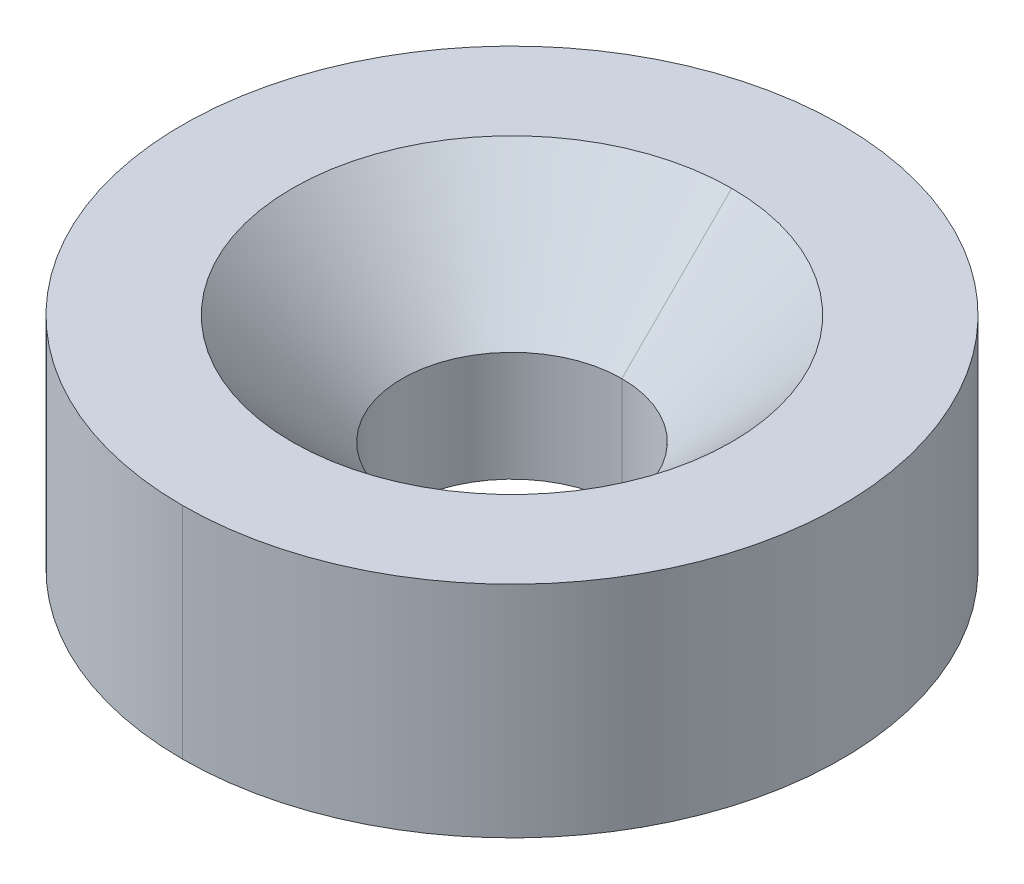
ISO-10303-21;
HEADER;
FILE_DESCRIPTION(('STEP AP214'),'2;1');
FILE_NAME('part.step','',(''),(''),'','','');
FILE_SCHEMA(('AUTOMOTIVE_DESIGN { 1 0 10303 214 1 1 1 1 }'));
ENDSEC;
DATA;
#1=APPLICATION_CONTEXT('core data for automotive mechanical design processes');
#2=APPLICATION_PROTOCOL_DEFINITION('international standard','automotive_design',2000,#1);
#3=PRODUCT_CONTEXT('',#1,'mechanical');
#4=PRODUCT('Part','Part','',(#3));
#5=PRODUCT_RELATED_PRODUCT_CATEGORY('part','',(#4));
#6=PRODUCT_DEFINITION_FORMATION('','',#4);
#7=PRODUCT_DEFINITION_CONTEXT('part definition',#1,'design');
#8=PRODUCT_DEFINITION('design','',#6,#7);
#9=PRODUCT_DEFINITION_SHAPE('','',#8);
#10=(LENGTH_UNIT() NAMED_UNIT(*) SI_UNIT(.MILLI.,.METRE.));
#11=(NAMED_UNIT(*) PLANE_ANGLE_UNIT() SI_UNIT($,.RADIAN.));
#12=(NAMED_UNIT(*) SI_UNIT($,.STERADIAN.) SOLID_ANGLE_UNIT());
#13=UNCERTAINTY_MEASURE_WITH_UNIT(LENGTH_MEASURE(1.E-05),#10,'distance_accuracy_value','');
#14=(GEOMETRIC_REPRESENTATION_CONTEXT(3) GLOBAL_UNCERTAINTY_ASSIGNED_CONTEXT((#13)) GLOBAL_UNIT_ASSIGNED_CONTEXT((#10,
#11,#12)) REPRESENTATION_CONTEXT('',''));
#15=CARTESIAN_POINT('',(0.,0.,0.));
#16=DIRECTION('',(0.,0.,1.));
#17=DIRECTION('',(1.,0.,0.));
#18=AXIS2_PLACEMENT_3D('',#15,#16,#17);
#19=CARTESIAN_POINT('',(0.,0.,0.));
#20=DIRECTION('',(0.,-1.,0.));
#21=DIRECTION('',(0.,0.,-1.));
#22=AXIS2_PLACEMENT_3D('',#19,#20,#21);
#23=CYLINDRICAL_SURFACE('',#22,1.5875);
#24=DIRECTION('',(0.,-1.,0.));
#25=VECTOR('',#24,1.);
#26=CARTESIAN_POINT('',(0.,0.,1.5875));
#27=LINE('',#26,#25);
#28=CARTESIAN_POINT('',(0.,0.,1.5875));
#29=VERTEX_POINT('',#28);
#30=CARTESIAN_POINT('',(0.,-1.5875,1.5875));
#31=VERTEX_POINT('',#30);
#32=EDGE_CURVE('E81',#29,#31,#27,.T.);
#33=ORIENTED_EDGE('',*,*,#32,.F.);
#34=CARTESIAN_POINT('',(0.,0.,0.));
#35=DIRECTION('',(0.,-1.,0.));
#36=DIRECTION('',(0.,0.,-1.));
#37=AXIS2_PLACEMENT_3D('',#34,#35,#36);
#38=CIRCLE('',#37,1.5875);
#39=CARTESIAN_POINT('',(0.,0.,-1.5875));
#40=VERTEX_POINT('',#39);
#41=EDGE_CURVE('E10',#40,#29,#38,.T.);
#42=ORIENTED_EDGE('',*,*,#41,.F.);
#43=DIRECTION('',(0.,-1.,0.));
#44=VECTOR('',#43,1.);
#45=CARTESIAN_POINT('',(0.,0.,-1.5875));
#46=LINE('',#45,#44);
#47=CARTESIAN_POINT('',(0.,-1.5875,-1.5875));
#48=VERTEX_POINT('',#47);
#49=EDGE_CURVE('E78',#40,#48,#46,.T.);
#50=ORIENTED_EDGE('',*,*,#49,.T.);
#51=CARTESIAN_POINT('',(0.,-1.5875,0.));
#52=DIRECTION('',(0.,-1.,0.));
#53=DIRECTION('',(0.,0.,-1.));
#54=AXIS2_PLACEMENT_3D('',#51,#52,#53);
#55=CIRCLE('',#54,1.5875);
#56=EDGE_CURVE('E27',#48,#31,#55,.T.);
#57=ORIENTED_EDGE('',*,*,#56,.T.);
#58=EDGE_LOOP('',(#33,#42,#50,#57));
#59=FACE_BOUND('',#58,.T.);
#60=ADVANCED_FACE('F16',(#59),#23,.F.);
#61=CARTESIAN_POINT('',(0.,0.,0.));
#62=DIRECTION('',(0.,1.,0.));
#63=DIRECTION('',(0.,0.,1.));
#64=AXIS2_PLACEMENT_3D('',#61,#62,#63);
#65=CONICAL_SURFACE('',#64,1.5875,0.785398163397443);
#66=DIRECTION('',(0.,0.707106781186552,-0.707106781186544));
#67=VECTOR('',#66,1.);
#68=CARTESIAN_POINT('',(0.,0.,-1.5875));
#69=LINE('',#68,#67);
#70=CARTESIAN_POINT('',(0.,1.5875,-3.175));
#71=VERTEX_POINT('',#70);
#72=EDGE_CURVE('E87',#40,#71,#69,.T.);
#73=ORIENTED_EDGE('',*,*,#72,.F.);
#74=ORIENTED_EDGE('',*,*,#41,.T.);
#75=DIRECTION('',(0.,0.707106781186552,0.707106781186544));
#76=VECTOR('',#75,1.);
#77=CARTESIAN_POINT('',(0.,0.,1.5875));
#78=LINE('',#77,#76);
#79=CARTESIAN_POINT('',(0.,1.5875,3.175));
#80=VERTEX_POINT('',#79);
#81=EDGE_CURVE('E104',#29,#80,#78,.T.);
#82=ORIENTED_EDGE('',*,*,#81,.T.);
#83=CARTESIAN_POINT('',(0.,1.5875,0.));
#84=DIRECTION('',(0.,-1.,0.));
#85=DIRECTION('',(0.,0.,-1.));
#86=AXIS2_PLACEMENT_3D('',#83,#84,#85);
#87=CIRCLE('',#86,3.175);
#88=EDGE_CURVE('E89',#71,#80,#87,.T.);
#89=ORIENTED_EDGE('',*,*,#88,.F.);
#90=EDGE_LOOP('',(#73,#74,#82,#89));
#91=FACE_BOUND('',#90,.T.);
#92=ADVANCED_FACE('F88',(#91),#65,.F.);
#93=CARTESIAN_POINT('',(0.,-1.5875,0.));
#94=DIRECTION('',(0.,1.,0.));
#95=DIRECTION('',(1.,0.,0.));
#96=AXIS2_PLACEMENT_3D('',#93,#94,#95);
#97=PLANE('',#96);
#98=ORIENTED_EDGE('',*,*,#56,.F.);
#99=CARTESIAN_POINT('',(0.,-1.5875,0.));
#100=DIRECTION('',(0.,-1.,0.));
#101=DIRECTION('',(0.,0.,-1.));
#102=AXIS2_PLACEMENT_3D('',#99,#100,#101);
#103=CIRCLE('',#102,1.5875);
#104=EDGE_CURVE('E100',#31,#48,#103,.T.);
#105=ORIENTED_EDGE('',*,*,#104,.F.);
#106=EDGE_LOOP('',(#98,#105));
#107=FACE_BOUND('',#106,.T.);
#108=CARTESIAN_POINT('',(0.,-1.5875,0.));
#109=DIRECTION('',(0.,1.,0.));
#110=DIRECTION('',(0.,0.,1.));
#111=AXIS2_PLACEMENT_3D('',#108,#109,#110);
#112=CIRCLE('',#111,4.7625);
#113=CARTESIAN_POINT('',(0.,-1.5875,-4.7625));
#114=VERTEX_POINT('',#113);
#115=CARTESIAN_POINT('',(0.,-1.5875,4.7625));
#116=VERTEX_POINT('',#115);
#117=EDGE_CURVE('E40',#114,#116,#112,.T.);
#118=ORIENTED_EDGE('',*,*,#117,.F.);
#119=CARTESIAN_POINT('',(0.,-1.5875,0.));
#120=DIRECTION('',(0.,1.,0.));
#121=DIRECTION('',(0.,0.,1.));
#122=AXIS2_PLACEMENT_3D('',#119,#120,#121);
#123=CIRCLE('',#122,4.7625);
#124=EDGE_CURVE('E120',#116,#114,#123,.T.);
#125=ORIENTED_EDGE('',*,*,#124,.F.);
#126=EDGE_LOOP('',(#118,#125));
#127=FACE_BOUND('',#126,.T.);
#128=ADVANCED_FACE('F218',(#107,#127),#97,.F.);
#129=CARTESIAN_POINT('',(0.,1.5875,0.));
#130=DIRECTION('',(0.,1.,0.));
#131=DIRECTION('',(1.,0.,0.));
#132=AXIS2_PLACEMENT_3D('',#129,#130,#131);
#133=PLANE('',#132);
#134=CARTESIAN_POINT('',(0.,1.5875,0.));
#135=DIRECTION('',(0.,-1.,0.));
#136=DIRECTION('',(0.,0.,-1.));
#137=AXIS2_PLACEMENT_3D('',#134,#135,#136);
#138=CIRCLE('',#137,3.175);
#139=EDGE_CURVE('E95',#80,#71,#138,.T.);
#140=ORIENTED_EDGE('',*,*,#139,.T.);
#141=ORIENTED_EDGE('',*,*,#88,.T.);
#142=EDGE_LOOP('',(#140,#141));
#143=FACE_BOUND('',#142,.T.);
#144=CARTESIAN_POINT('',(0.,1.5875,0.));
#145=DIRECTION('',(0.,1.,0.));
#146=DIRECTION('',(0.,0.,1.));
#147=AXIS2_PLACEMENT_3D('',#144,#145,#146);
#148=CIRCLE('',#147,4.7625);
#149=CARTESIAN_POINT('',(0.,1.5875,-4.7625));
#150=VERTEX_POINT('',#149);
#151=CARTESIAN_POINT('',(0.,1.5875,4.7625));
#152=VERTEX_POINT('',#151);
#153=EDGE_CURVE('E121',#150,#152,#148,.T.);
#154=ORIENTED_EDGE('',*,*,#153,.T.);
#155=CARTESIAN_POINT('',(0.,1.5875,0.));
#156=DIRECTION('',(0.,1.,0.));
#157=DIRECTION('',(0.,0.,1.));
#158=AXIS2_PLACEMENT_3D('',#155,#156,#157);
#159=CIRCLE('',#158,4.7625);
#160=EDGE_CURVE('E115',#152,#150,#159,.T.);
#161=ORIENTED_EDGE('',*,*,#160,.T.);
#162=EDGE_LOOP('',(#154,#161));
#163=FACE_BOUND('',#162,.T.);
#164=ADVANCED_FACE('F149',(#143,#163),#133,.T.);
#165=CARTESIAN_POINT('',(0.,1.5875,0.));
#166=DIRECTION('',(0.,-1.,0.));
#167=DIRECTION('',(0.,0.,-1.));
#168=AXIS2_PLACEMENT_3D('',#165,#166,#167);
#169=CYLINDRICAL_SURFACE('',#168,4.7625);
#170=DIRECTION('',(0.,-1.,0.));
#171=VECTOR('',#170,1.);
#172=CARTESIAN_POINT('',(0.,1.5875,4.7625));
#173=LINE('',#172,#171);
#174=EDGE_CURVE('E117',#152,#116,#173,.T.);
#175=ORIENTED_EDGE('',*,*,#174,.F.);
#176=ORIENTED_EDGE('',*,*,#153,.F.);
#177=DIRECTION('',(0.,-1.,0.));
#178=VECTOR('',#177,1.);
#179=CARTESIAN_POINT('',(0.,1.5875,-4.7625));
#180=LINE('',#179,#178);
#181=EDGE_CURVE('E20',#150,#114,#180,.T.);
#182=ORIENTED_EDGE('',*,*,#181,.T.);
#183=ORIENTED_EDGE('',*,*,#117,.T.);
#184=EDGE_LOOP('',(#175,#176,#182,#183));
#185=FACE_BOUND('',#184,.T.);
#186=ADVANCED_FACE('F144',(#185),#169,.T.);
#187=CARTESIAN_POINT('',(0.,1.5875,0.));
#188=DIRECTION('',(0.,-1.,0.));
#189=DIRECTION('',(0.,0.,-1.));
#190=AXIS2_PLACEMENT_3D('',#187,#188,#189);
#191=CYLINDRICAL_SURFACE('',#190,4.7625);
#192=ORIENTED_EDGE('',*,*,#160,.F.);
#193=ORIENTED_EDGE('',*,*,#174,.T.);
#194=ORIENTED_EDGE('',*,*,#124,.T.);
#195=ORIENTED_EDGE('',*,*,#181,.F.);
#196=EDGE_LOOP('',(#192,#193,#194,#195));
#197=FACE_BOUND('',#196,.T.);
#198=ADVANCED_FACE('F147',(#197),#191,.T.);
#199=CARTESIAN_POINT('',(0.,0.,0.));
#200=DIRECTION('',(0.,1.,0.));
#201=DIRECTION('',(0.,0.,1.));
#202=AXIS2_PLACEMENT_3D('',#199,#200,#201);
#203=CONICAL_SURFACE('',#202,1.5875,0.785398163397443);
#204=CARTESIAN_POINT('',(0.,0.,0.));
#205=DIRECTION('',(0.,-1.,0.));
#206=DIRECTION('',(0.,0.,-1.));
#207=AXIS2_PLACEMENT_3D('',#204,#205,#206);
#208=CIRCLE('',#207,1.5875);
#209=EDGE_CURVE('E98',#29,#40,#208,.T.);
#210=ORIENTED_EDGE('',*,*,#209,.T.);
#211=ORIENTED_EDGE('',*,*,#72,.T.);
#212=ORIENTED_EDGE('',*,*,#139,.F.);
#213=ORIENTED_EDGE('',*,*,#81,.F.);
#214=EDGE_LOOP('',(#210,#211,#212,#213));
#215=FACE_BOUND('',#214,.T.);
#216=ADVANCED_FACE('F103',(#215),#203,.F.);
#217=CARTESIAN_POINT('',(0.,0.,0.));
#218=DIRECTION('',(0.,-1.,0.));
#219=DIRECTION('',(0.,0.,-1.));
#220=AXIS2_PLACEMENT_3D('',#217,#218,#219);
#221=CYLINDRICAL_SURFACE('',#220,1.5875);
#222=ORIENTED_EDGE('',*,*,#209,.F.);
#223=ORIENTED_EDGE('',*,*,#32,.T.);
#224=ORIENTED_EDGE('',*,*,#104,.T.);
#225=ORIENTED_EDGE('',*,*,#49,.F.);
#226=EDGE_LOOP('',(#222,#223,#224,#225));
#227=FACE_BOUND('',#226,.T.);
#228=ADVANCED_FACE('F18',(#227),#221,.F.);
#229=CLOSED_SHELL('',(#60,#92,#128,#164,#186,#198,#216,#228));
#230=MANIFOLD_SOLID_BREP('B1',#229);
#231=ADVANCED_BREP_SHAPE_REPRESENTATION('',(#18,#230),#14);
#232=SHAPE_DEFINITION_REPRESENTATION(#9,#231);
ENDSEC;
END-ISO-10303-21;
